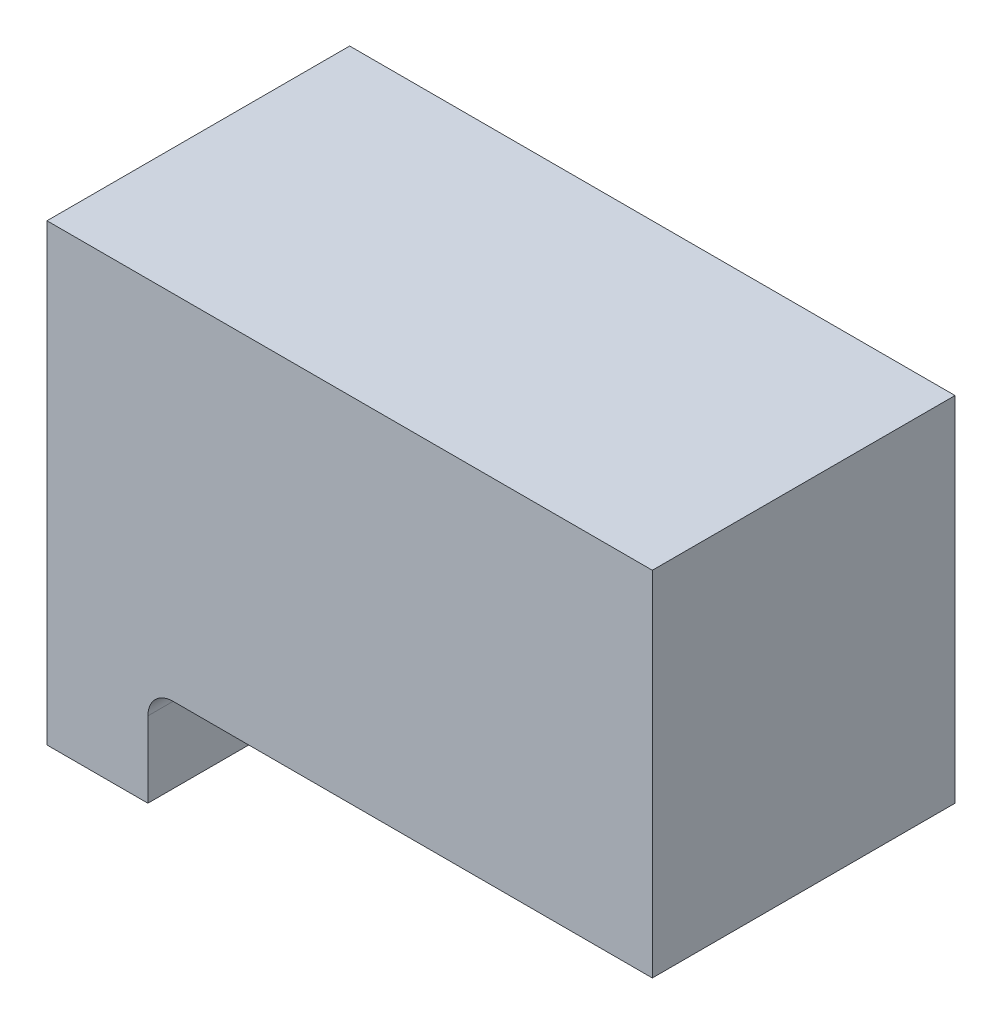
ISO-10303-21;
HEADER;
FILE_DESCRIPTION(('STEP AP214'),'2;1');
FILE_NAME('part.step','',(''),(''),'','','');
FILE_SCHEMA(('AUTOMOTIVE_DESIGN { 1 0 10303 214 1 1 1 1 }'));
ENDSEC;
DATA;
#1=APPLICATION_CONTEXT('core data for automotive mechanical design processes');
#2=APPLICATION_PROTOCOL_DEFINITION('international standard','automotive_design',2000,#1);
#3=PRODUCT_CONTEXT('',#1,'mechanical');
#4=PRODUCT('Part','Part','',(#3));
#5=PRODUCT_RELATED_PRODUCT_CATEGORY('part','',(#4));
#6=PRODUCT_DEFINITION_FORMATION('','',#4);
#7=PRODUCT_DEFINITION_CONTEXT('part definition',#1,'design');
#8=PRODUCT_DEFINITION('design','',#6,#7);
#9=PRODUCT_DEFINITION_SHAPE('','',#8);
#10=(LENGTH_UNIT() NAMED_UNIT(*) SI_UNIT(.MILLI.,.METRE.));
#11=(NAMED_UNIT(*) PLANE_ANGLE_UNIT() SI_UNIT($,.RADIAN.));
#12=(NAMED_UNIT(*) SI_UNIT($,.STERADIAN.) SOLID_ANGLE_UNIT());
#13=UNCERTAINTY_MEASURE_WITH_UNIT(LENGTH_MEASURE(1.E-05),#10,'distance_accuracy_value','');
#14=(GEOMETRIC_REPRESENTATION_CONTEXT(3) GLOBAL_UNCERTAINTY_ASSIGNED_CONTEXT((#13)) GLOBAL_UNIT_ASSIGNED_CONTEXT((#10,
#11,#12)) REPRESENTATION_CONTEXT('',''));
#15=CARTESIAN_POINT('',(0.,0.,0.));
#16=DIRECTION('',(0.,0.,1.));
#17=DIRECTION('',(1.,0.,0.));
#18=AXIS2_PLACEMENT_3D('',#15,#16,#17);
#19=CARTESIAN_POINT('',(0.,0.,25.));
#20=DIRECTION('',(0.,0.,-1.));
#21=DIRECTION('',(-1.,0.,0.));
#22=AXIS2_PLACEMENT_3D('',#19,#20,#21);
#23=PLANE('',#22);
#24=DIRECTION('',(0.,1.,0.));
#25=VECTOR('',#24,1.);
#26=CARTESIAN_POINT('',(5.,0.,25.));
#27=LINE('',#26,#25);
#28=CARTESIAN_POINT('',(4.99999999999999,27.5,25.));
#29=VERTEX_POINT('',#28);
#30=CARTESIAN_POINT('',(5.,7.5,25.));
#31=VERTEX_POINT('',#30);
#32=EDGE_CURVE('E164',#29,#31,#27,.F.);
#33=ORIENTED_EDGE('',*,*,#32,.F.);
#34=CARTESIAN_POINT('',(7.49999999999999,27.5,25.));
#35=DIRECTION('',(0.,0.,1.));
#36=DIRECTION('',(1.,0.,0.));
#37=AXIS2_PLACEMENT_3D('',#34,#35,#36);
#38=CIRCLE('',#37,2.5);
#39=CARTESIAN_POINT('',(7.49999999999999,30.,25.));
#40=VERTEX_POINT('',#39);
#41=EDGE_CURVE('E160',#29,#40,#38,.F.);
#42=ORIENTED_EDGE('',*,*,#41,.T.);
#43=DIRECTION('',(1.,0.,0.));
#44=VECTOR('',#43,1.);
#45=CARTESIAN_POINT('',(0.,30.,25.));
#46=LINE('',#45,#44);
#47=CARTESIAN_POINT('',(27.5,30.,25.));
#48=VERTEX_POINT('',#47);
#49=EDGE_CURVE('E156',#48,#40,#46,.F.);
#50=ORIENTED_EDGE('',*,*,#49,.F.);
#51=CARTESIAN_POINT('',(27.5,27.5,25.));
#52=DIRECTION('',(0.,0.,-1.));
#53=DIRECTION('',(-1.,0.,0.));
#54=AXIS2_PLACEMENT_3D('',#51,#52,#53);
#55=CIRCLE('',#54,2.5);
#56=CARTESIAN_POINT('',(30.,27.5,25.));
#57=VERTEX_POINT('',#56);
#58=EDGE_CURVE('E134',#48,#57,#55,.T.);
#59=ORIENTED_EDGE('',*,*,#58,.T.);
#60=DIRECTION('',(0.,1.,0.));
#61=VECTOR('',#60,1.);
#62=CARTESIAN_POINT('',(30.,0.,25.));
#63=LINE('',#62,#61);
#64=CARTESIAN_POINT('',(30.,7.5,25.));
#65=VERTEX_POINT('',#64);
#66=EDGE_CURVE('E132',#57,#65,#63,.F.);
#67=ORIENTED_EDGE('',*,*,#66,.T.);
#68=CARTESIAN_POINT('',(27.5,7.5,25.));
#69=DIRECTION('',(0.,0.,1.));
#70=DIRECTION('',(1.,0.,0.));
#71=AXIS2_PLACEMENT_3D('',#68,#69,#70);
#72=CIRCLE('',#71,2.5);
#73=CARTESIAN_POINT('',(27.5,5.,25.));
#74=VERTEX_POINT('',#73);
#75=EDGE_CURVE('E20',#65,#74,#72,.F.);
#76=ORIENTED_EDGE('',*,*,#75,.T.);
#77=DIRECTION('',(1.,0.,0.));
#78=VECTOR('',#77,1.);
#79=CARTESIAN_POINT('',(0.,5.,25.));
#80=LINE('',#79,#78);
#81=CARTESIAN_POINT('',(7.5,5.,25.));
#82=VERTEX_POINT('',#81);
#83=EDGE_CURVE('E169',#74,#82,#80,.F.);
#84=ORIENTED_EDGE('',*,*,#83,.T.);
#85=CARTESIAN_POINT('',(7.5,7.5,25.));
#86=DIRECTION('',(0.,0.,-1.));
#87=DIRECTION('',(-1.,0.,0.));
#88=AXIS2_PLACEMENT_3D('',#85,#86,#87);
#89=CIRCLE('',#88,2.5);
#90=EDGE_CURVE('E168',#82,#31,#89,.T.);
#91=ORIENTED_EDGE('',*,*,#90,.T.);
#92=EDGE_LOOP('',(#33,#42,#50,#59,#67,#76,#84,#91));
#93=FACE_BOUND('',#92,.T.);
#94=ADVANCED_FACE('F17',(#93),#23,.T.);
#95=CARTESIAN_POINT('',(27.5,7.5,25.));
#96=DIRECTION('',(0.,0.,1.));
#97=DIRECTION('',(1.,0.,0.));
#98=AXIS2_PLACEMENT_3D('',#95,#96,#97);
#99=CYLINDRICAL_SURFACE('',#98,2.5);
#100=DIRECTION('',(0.,0.,1.));
#101=VECTOR('',#100,1.);
#102=CARTESIAN_POINT('',(30.,7.5,25.));
#103=LINE('',#102,#101);
#104=CARTESIAN_POINT('',(30.,7.5,0.));
#105=VERTEX_POINT('',#104);
#106=EDGE_CURVE('E125',#65,#105,#103,.F.);
#107=ORIENTED_EDGE('',*,*,#106,.T.);
#108=CARTESIAN_POINT('',(27.5,7.5,0.));
#109=DIRECTION('',(0.,0.,1.));
#110=DIRECTION('',(1.,0.,0.));
#111=AXIS2_PLACEMENT_3D('',#108,#109,#110);
#112=CIRCLE('',#111,2.5);
#113=CARTESIAN_POINT('',(27.5,5.,0.));
#114=VERTEX_POINT('',#113);
#115=EDGE_CURVE('E138',#105,#114,#112,.F.);
#116=ORIENTED_EDGE('',*,*,#115,.T.);
#117=DIRECTION('',(0.,0.,1.));
#118=VECTOR('',#117,1.);
#119=CARTESIAN_POINT('',(27.5,5.,25.));
#120=LINE('',#119,#118);
#121=EDGE_CURVE('E128',#114,#74,#120,.T.);
#122=ORIENTED_EDGE('',*,*,#121,.T.);
#123=ORIENTED_EDGE('',*,*,#75,.F.);
#124=EDGE_LOOP('',(#107,#116,#122,#123));
#125=FACE_BOUND('',#124,.T.);
#126=ADVANCED_FACE('F123',(#125),#99,.F.);
#127=CARTESIAN_POINT('',(0.,5.,25.));
#128=DIRECTION('',(0.,-1.,0.));
#129=DIRECTION('',(1.,0.,0.));
#130=AXIS2_PLACEMENT_3D('',#127,#128,#129);
#131=PLANE('',#130);
#132=ORIENTED_EDGE('',*,*,#121,.F.);
#133=DIRECTION('',(1.,0.,0.));
#134=VECTOR('',#133,1.);
#135=CARTESIAN_POINT('',(0.,5.,0.));
#136=LINE('',#135,#134);
#137=CARTESIAN_POINT('',(7.5,5.,0.));
#138=VERTEX_POINT('',#137);
#139=EDGE_CURVE('E193',#114,#138,#136,.F.);
#140=ORIENTED_EDGE('',*,*,#139,.T.);
#141=DIRECTION('',(0.,0.,-1.));
#142=VECTOR('',#141,1.);
#143=CARTESIAN_POINT('',(7.5,5.,25.));
#144=LINE('',#143,#142);
#145=EDGE_CURVE('E165',#138,#82,#144,.F.);
#146=ORIENTED_EDGE('',*,*,#145,.T.);
#147=ORIENTED_EDGE('',*,*,#83,.F.);
#148=EDGE_LOOP('',(#132,#140,#146,#147));
#149=FACE_BOUND('',#148,.T.);
#150=ADVANCED_FACE('F445',(#149),#131,.F.);
#151=CARTESIAN_POINT('',(7.5,7.5,25.));
#152=DIRECTION('',(0.,0.,-1.));
#153=DIRECTION('',(-1.,0.,0.));
#154=AXIS2_PLACEMENT_3D('',#151,#152,#153);
#155=CYLINDRICAL_SURFACE('',#154,2.5);
#156=ORIENTED_EDGE('',*,*,#145,.F.);
#157=CARTESIAN_POINT('',(7.5,7.5,0.));
#158=DIRECTION('',(0.,0.,-1.));
#159=DIRECTION('',(-1.,0.,0.));
#160=AXIS2_PLACEMENT_3D('',#157,#158,#159);
#161=CIRCLE('',#160,2.5);
#162=CARTESIAN_POINT('',(5.,7.5,0.));
#163=VERTEX_POINT('',#162);
#164=EDGE_CURVE('E191',#138,#163,#161,.T.);
#165=ORIENTED_EDGE('',*,*,#164,.T.);
#166=DIRECTION('',(0.,0.,1.));
#167=VECTOR('',#166,1.);
#168=CARTESIAN_POINT('',(5.,7.5,25.));
#169=LINE('',#168,#167);
#170=EDGE_CURVE('E161',#31,#163,#169,.F.);
#171=ORIENTED_EDGE('',*,*,#170,.F.);
#172=ORIENTED_EDGE('',*,*,#90,.F.);
#173=EDGE_LOOP('',(#156,#165,#171,#172));
#174=FACE_BOUND('',#173,.T.);
#175=ADVANCED_FACE('F199',(#174),#155,.F.);
#176=CARTESIAN_POINT('',(5.,0.,25.));
#177=DIRECTION('',(1.,0.,0.));
#178=DIRECTION('',(0.,1.,0.));
#179=AXIS2_PLACEMENT_3D('',#176,#177,#178);
#180=PLANE('',#179);
#181=ORIENTED_EDGE('',*,*,#32,.T.);
#182=ORIENTED_EDGE('',*,*,#170,.T.);
#183=DIRECTION('',(0.,1.,0.));
#184=VECTOR('',#183,1.);
#185=CARTESIAN_POINT('',(5.,0.,0.));
#186=LINE('',#185,#184);
#187=CARTESIAN_POINT('',(4.99999999999999,27.5,0.));
#188=VERTEX_POINT('',#187);
#189=EDGE_CURVE('E190',#163,#188,#186,.T.);
#190=ORIENTED_EDGE('',*,*,#189,.T.);
#191=DIRECTION('',(0.,0.,1.));
#192=VECTOR('',#191,1.);
#193=CARTESIAN_POINT('',(4.99999999999999,27.5,25.));
#194=LINE('',#193,#192);
#195=EDGE_CURVE('E157',#188,#29,#194,.T.);
#196=ORIENTED_EDGE('',*,*,#195,.T.);
#197=EDGE_LOOP('',(#181,#182,#190,#196));
#198=FACE_BOUND('',#197,.T.);
#199=ADVANCED_FACE('F203',(#198),#180,.T.);
#200=CARTESIAN_POINT('',(7.49999999999999,27.5,25.));
#201=DIRECTION('',(0.,0.,1.));
#202=DIRECTION('',(1.,0.,0.));
#203=AXIS2_PLACEMENT_3D('',#200,#201,#202);
#204=CYLINDRICAL_SURFACE('',#203,2.5);
#205=ORIENTED_EDGE('',*,*,#195,.F.);
#206=CARTESIAN_POINT('',(7.49999999999999,27.5,0.));
#207=DIRECTION('',(0.,0.,1.));
#208=DIRECTION('',(1.,0.,0.));
#209=AXIS2_PLACEMENT_3D('',#206,#207,#208);
#210=CIRCLE('',#209,2.5);
#211=CARTESIAN_POINT('',(7.49999999999999,30.,0.));
#212=VERTEX_POINT('',#211);
#213=EDGE_CURVE('E188',#188,#212,#210,.F.);
#214=ORIENTED_EDGE('',*,*,#213,.T.);
#215=DIRECTION('',(0.,0.,-1.));
#216=VECTOR('',#215,1.);
#217=CARTESIAN_POINT('',(7.49999999999999,30.,25.));
#218=LINE('',#217,#216);
#219=EDGE_CURVE('E153',#40,#212,#218,.T.);
#220=ORIENTED_EDGE('',*,*,#219,.F.);
#221=ORIENTED_EDGE('',*,*,#41,.F.);
#222=EDGE_LOOP('',(#205,#214,#220,#221));
#223=FACE_BOUND('',#222,.T.);
#224=ADVANCED_FACE('F209',(#223),#204,.F.);
#225=CARTESIAN_POINT('',(0.,30.,25.));
#226=DIRECTION('',(0.,-1.,0.));
#227=DIRECTION('',(0.,0.,-1.));
#228=AXIS2_PLACEMENT_3D('',#225,#226,#227);
#229=PLANE('',#228);
#230=ORIENTED_EDGE('',*,*,#49,.T.);
#231=ORIENTED_EDGE('',*,*,#219,.T.);
#232=DIRECTION('',(1.,0.,0.));
#233=VECTOR('',#232,1.);
#234=CARTESIAN_POINT('',(0.,30.,0.));
#235=LINE('',#234,#233);
#236=CARTESIAN_POINT('',(27.5,30.,0.));
#237=VERTEX_POINT('',#236);
#238=EDGE_CURVE('E187',#212,#237,#235,.T.);
#239=ORIENTED_EDGE('',*,*,#238,.T.);
#240=DIRECTION('',(0.,0.,-1.));
#241=VECTOR('',#240,1.);
#242=CARTESIAN_POINT('',(27.5,30.,25.));
#243=LINE('',#242,#241);
#244=EDGE_CURVE('E147',#237,#48,#243,.F.);
#245=ORIENTED_EDGE('',*,*,#244,.T.);
#246=EDGE_LOOP('',(#230,#231,#239,#245));
#247=FACE_BOUND('',#246,.T.);
#248=ADVANCED_FACE('F212',(#247),#229,.T.);
#249=CARTESIAN_POINT('',(27.5,27.5,25.));
#250=DIRECTION('',(0.,0.,-1.));
#251=DIRECTION('',(-1.,0.,0.));
#252=AXIS2_PLACEMENT_3D('',#249,#250,#251);
#253=CYLINDRICAL_SURFACE('',#252,2.5);
#254=ORIENTED_EDGE('',*,*,#244,.F.);
#255=CARTESIAN_POINT('',(27.5,27.5,0.));
#256=DIRECTION('',(0.,0.,-1.));
#257=DIRECTION('',(-1.,0.,0.));
#258=AXIS2_PLACEMENT_3D('',#255,#256,#257);
#259=CIRCLE('',#258,2.5);
#260=CARTESIAN_POINT('',(30.,27.5,0.));
#261=VERTEX_POINT('',#260);
#262=EDGE_CURVE('E185',#237,#261,#259,.T.);
#263=ORIENTED_EDGE('',*,*,#262,.T.);
#264=DIRECTION('',(0.,0.,1.));
#265=VECTOR('',#264,1.);
#266=CARTESIAN_POINT('',(30.,27.5,25.));
#267=LINE('',#266,#265);
#268=EDGE_CURVE('E139',#261,#57,#267,.T.);
#269=ORIENTED_EDGE('',*,*,#268,.T.);
#270=ORIENTED_EDGE('',*,*,#58,.F.);
#271=EDGE_LOOP('',(#254,#263,#269,#270));
#272=FACE_BOUND('',#271,.T.);
#273=ADVANCED_FACE('F216',(#272),#253,.F.);
#274=CARTESIAN_POINT('',(30.,0.,25.));
#275=DIRECTION('',(1.,0.,0.));
#276=DIRECTION('',(0.,1.,0.));
#277=AXIS2_PLACEMENT_3D('',#274,#275,#276);
#278=PLANE('',#277);
#279=ORIENTED_EDGE('',*,*,#268,.F.);
#280=DIRECTION('',(0.,1.,0.));
#281=VECTOR('',#280,1.);
#282=CARTESIAN_POINT('',(30.,0.,0.));
#283=LINE('',#282,#281);
#284=EDGE_CURVE('E143',#261,#105,#283,.F.);
#285=ORIENTED_EDGE('',*,*,#284,.T.);
#286=ORIENTED_EDGE('',*,*,#106,.F.);
#287=ORIENTED_EDGE('',*,*,#66,.F.);
#288=EDGE_LOOP('',(#279,#285,#286,#287));
#289=FACE_BOUND('',#288,.T.);
#290=ADVANCED_FACE('F141',(#289),#278,.F.);
#291=CARTESIAN_POINT('',(0.,0.,0.));
#292=DIRECTION('',(0.,0.,1.));
#293=DIRECTION('',(1.,0.,0.));
#294=AXIS2_PLACEMENT_3D('',#291,#292,#293);
#295=PLANE('',#294);
#296=ORIENTED_EDGE('',*,*,#262,.F.);
#297=ORIENTED_EDGE('',*,*,#238,.F.);
#298=ORIENTED_EDGE('',*,*,#213,.F.);
#299=ORIENTED_EDGE('',*,*,#189,.F.);
#300=ORIENTED_EDGE('',*,*,#164,.F.);
#301=ORIENTED_EDGE('',*,*,#139,.F.);
#302=ORIENTED_EDGE('',*,*,#115,.F.);
#303=ORIENTED_EDGE('',*,*,#284,.F.);
#304=EDGE_LOOP('',(#296,#297,#298,#299,#300,#301,#302,#303));
#305=FACE_BOUND('',#304,.T.);
#306=CARTESIAN_POINT('',(12.5,-2.5,0.));
#307=DIRECTION('',(0.,0.,-1.));
#308=DIRECTION('',(-1.,0.,0.));
#309=AXIS2_PLACEMENT_3D('',#306,#307,#308);
#310=CIRCLE('',#309,2.5);
#311=CARTESIAN_POINT('',(12.5,0.,0.));
#312=VERTEX_POINT('',#311);
#313=CARTESIAN_POINT('',(10.,-2.5,0.));
#314=VERTEX_POINT('',#313);
#315=EDGE_CURVE('E181',#312,#314,#310,.F.);
#316=ORIENTED_EDGE('',*,*,#315,.T.);
#317=DIRECTION('',(0.,1.,0.));
#318=VECTOR('',#317,1.);
#319=CARTESIAN_POINT('',(10.,-10.,0.));
#320=LINE('',#319,#318);
#321=CARTESIAN_POINT('',(10.,-10.,0.));
#322=VERTEX_POINT('',#321);
#323=EDGE_CURVE('E249',#322,#314,#320,.T.);
#324=ORIENTED_EDGE('',*,*,#323,.F.);
#325=DIRECTION('',(1.,0.,0.));
#326=VECTOR('',#325,1.);
#327=CARTESIAN_POINT('',(0.,-10.,0.));
#328=LINE('',#327,#326);
#329=CARTESIAN_POINT('',(0.,-10.,0.));
#330=VERTEX_POINT('',#329);
#331=EDGE_CURVE('E252',#330,#322,#328,.T.);
#332=ORIENTED_EDGE('',*,*,#331,.F.);
#333=DIRECTION('',(0.,-1.,0.));
#334=VECTOR('',#333,1.);
#335=CARTESIAN_POINT('',(0.,0.,0.));
#336=LINE('',#335,#334);
#337=CARTESIAN_POINT('',(0.,35.,0.));
#338=VERTEX_POINT('',#337);
#339=EDGE_CURVE('E221',#338,#330,#336,.T.);
#340=ORIENTED_EDGE('',*,*,#339,.F.);
#341=DIRECTION('',(1.,0.,0.));
#342=VECTOR('',#341,1.);
#343=CARTESIAN_POINT('',(0.,35.,0.));
#344=LINE('',#343,#342);
#345=CARTESIAN_POINT('',(60.,35.,0.));
#346=VERTEX_POINT('',#345);
#347=EDGE_CURVE('E235',#346,#338,#344,.F.);
#348=ORIENTED_EDGE('',*,*,#347,.F.);
#349=DIRECTION('',(0.,-1.,0.));
#350=VECTOR('',#349,1.);
#351=CARTESIAN_POINT('',(60.,0.,0.));
#352=LINE('',#351,#350);
#353=CARTESIAN_POINT('',(60.,0.,0.));
#354=VERTEX_POINT('',#353);
#355=EDGE_CURVE('E232',#346,#354,#352,.T.);
#356=ORIENTED_EDGE('',*,*,#355,.T.);
#357=DIRECTION('',(1.,0.,0.));
#358=VECTOR('',#357,1.);
#359=CARTESIAN_POINT('',(0.,0.,0.));
#360=LINE('',#359,#358);
#361=EDGE_CURVE('E244',#354,#312,#360,.F.);
#362=ORIENTED_EDGE('',*,*,#361,.T.);
#363=EDGE_LOOP('',(#316,#324,#332,#340,#348,#356,#362));
#364=FACE_BOUND('',#363,.T.);
#365=ADVANCED_FACE('F218',(#305,#364),#295,.F.);
#366=CARTESIAN_POINT('',(0.,0.,30.));
#367=DIRECTION('',(-1.,0.,0.));
#368=DIRECTION('',(0.,-1.,0.));
#369=AXIS2_PLACEMENT_3D('',#366,#367,#368);
#370=PLANE('',#369);
#371=DIRECTION('',(0.,1.,0.));
#372=VECTOR('',#371,1.);
#373=CARTESIAN_POINT('',(0.,0.,30.));
#374=LINE('',#373,#372);
#375=CARTESIAN_POINT('',(0.,35.,30.));
#376=VERTEX_POINT('',#375);
#377=CARTESIAN_POINT('',(0.,-10.,30.));
#378=VERTEX_POINT('',#377);
#379=EDGE_CURVE('E240',#376,#378,#374,.F.);
#380=ORIENTED_EDGE('',*,*,#379,.F.);
#381=DIRECTION('',(0.,0.,1.));
#382=VECTOR('',#381,1.);
#383=CARTESIAN_POINT('',(0.,35.,30.));
#384=LINE('',#383,#382);
#385=EDGE_CURVE('E241',#338,#376,#384,.T.);
#386=ORIENTED_EDGE('',*,*,#385,.F.);
#387=ORIENTED_EDGE('',*,*,#339,.T.);
#388=DIRECTION('',(0.,0.,-1.));
#389=VECTOR('',#388,1.);
#390=CARTESIAN_POINT('',(0.,-10.,0.));
#391=LINE('',#390,#389);
#392=EDGE_CURVE('E223',#378,#330,#391,.T.);
#393=ORIENTED_EDGE('',*,*,#392,.F.);
#394=EDGE_LOOP('',(#380,#386,#387,#393));
#395=FACE_BOUND('',#394,.T.);
#396=ADVANCED_FACE('F324',(#395),#370,.T.);
#397=CARTESIAN_POINT('',(0.,-10.,0.));
#398=DIRECTION('',(0.,-1.,0.));
#399=DIRECTION('',(0.,0.,-1.));
#400=AXIS2_PLACEMENT_3D('',#397,#398,#399);
#401=PLANE('',#400);
#402=ORIENTED_EDGE('',*,*,#392,.T.);
#403=ORIENTED_EDGE('',*,*,#331,.T.);
#404=DIRECTION('',(0.,0.,-1.));
#405=VECTOR('',#404,1.);
#406=CARTESIAN_POINT('',(10.,-10.,0.));
#407=LINE('',#406,#405);
#408=CARTESIAN_POINT('',(10.,-10.,30.));
#409=VERTEX_POINT('',#408);
#410=EDGE_CURVE('E184',#409,#322,#407,.T.);
#411=ORIENTED_EDGE('',*,*,#410,.F.);
#412=DIRECTION('',(1.,0.,0.));
#413=VECTOR('',#412,1.);
#414=CARTESIAN_POINT('',(0.,-10.,30.));
#415=LINE('',#414,#413);
#416=EDGE_CURVE('E271',#378,#409,#415,.T.);
#417=ORIENTED_EDGE('',*,*,#416,.F.);
#418=EDGE_LOOP('',(#402,#403,#411,#417));
#419=FACE_BOUND('',#418,.T.);
#420=ADVANCED_FACE('F322',(#419),#401,.T.);
#421=CARTESIAN_POINT('',(10.,-10.,0.));
#422=DIRECTION('',(1.,0.,0.));
#423=DIRECTION('',(0.,0.,-1.));
#424=AXIS2_PLACEMENT_3D('',#421,#422,#423);
#425=PLANE('',#424);
#426=DIRECTION('',(0.,1.,0.));
#427=VECTOR('',#426,1.);
#428=CARTESIAN_POINT('',(10.,0.,30.));
#429=LINE('',#428,#427);
#430=CARTESIAN_POINT('',(10.,-2.5,30.));
#431=VERTEX_POINT('',#430);
#432=EDGE_CURVE('E180',#409,#431,#429,.T.);
#433=ORIENTED_EDGE('',*,*,#432,.F.);
#434=ORIENTED_EDGE('',*,*,#410,.T.);
#435=ORIENTED_EDGE('',*,*,#323,.T.);
#436=DIRECTION('',(0.,0.,-1.));
#437=VECTOR('',#436,1.);
#438=CARTESIAN_POINT('',(10.,-2.5,30.));
#439=LINE('',#438,#437);
#440=EDGE_CURVE('E183',#314,#431,#439,.F.);
#441=ORIENTED_EDGE('',*,*,#440,.T.);
#442=EDGE_LOOP('',(#433,#434,#435,#441));
#443=FACE_BOUND('',#442,.T.);
#444=ADVANCED_FACE('F321',(#443),#425,.T.);
#445=CARTESIAN_POINT('',(12.5,-2.5,30.));
#446=DIRECTION('',(0.,0.,-1.));
#447=DIRECTION('',(-1.,0.,0.));
#448=AXIS2_PLACEMENT_3D('',#445,#446,#447);
#449=CYLINDRICAL_SURFACE('',#448,2.5);
#450=ORIENTED_EDGE('',*,*,#440,.F.);
#451=ORIENTED_EDGE('',*,*,#315,.F.);
#452=DIRECTION('',(0.,0.,1.));
#453=VECTOR('',#452,1.);
#454=CARTESIAN_POINT('',(12.5,0.,30.));
#455=LINE('',#454,#453);
#456=CARTESIAN_POINT('',(12.5,0.,30.));
#457=VERTEX_POINT('',#456);
#458=EDGE_CURVE('E246',#312,#457,#455,.T.);
#459=ORIENTED_EDGE('',*,*,#458,.T.);
#460=CARTESIAN_POINT('',(12.5,-2.5,30.));
#461=DIRECTION('',(0.,0.,-1.));
#462=DIRECTION('',(-1.,0.,0.));
#463=AXIS2_PLACEMENT_3D('',#460,#461,#462);
#464=CIRCLE('',#463,2.5);
#465=EDGE_CURVE('E176',#431,#457,#464,.T.);
#466=ORIENTED_EDGE('',*,*,#465,.F.);
#467=EDGE_LOOP('',(#450,#451,#459,#466));
#468=FACE_BOUND('',#467,.T.);
#469=ADVANCED_FACE('F319',(#468),#449,.F.);
#470=CARTESIAN_POINT('',(0.,0.,30.));
#471=DIRECTION('',(0.,1.,0.));
#472=DIRECTION('',(0.,0.,1.));
#473=AXIS2_PLACEMENT_3D('',#470,#471,#472);
#474=PLANE('',#473);
#475=ORIENTED_EDGE('',*,*,#458,.F.);
#476=ORIENTED_EDGE('',*,*,#361,.F.);
#477=DIRECTION('',(0.,0.,1.));
#478=VECTOR('',#477,1.);
#479=CARTESIAN_POINT('',(60.,0.,30.));
#480=LINE('',#479,#478);
#481=CARTESIAN_POINT('',(60.,0.,30.));
#482=VERTEX_POINT('',#481);
#483=EDGE_CURVE('E236',#354,#482,#480,.T.);
#484=ORIENTED_EDGE('',*,*,#483,.T.);
#485=DIRECTION('',(1.,0.,0.));
#486=VECTOR('',#485,1.);
#487=CARTESIAN_POINT('',(0.,0.,30.));
#488=LINE('',#487,#486);
#489=EDGE_CURVE('E179',#457,#482,#488,.T.);
#490=ORIENTED_EDGE('',*,*,#489,.F.);
#491=EDGE_LOOP('',(#475,#476,#484,#490));
#492=FACE_BOUND('',#491,.T.);
#493=ADVANCED_FACE('F315',(#492),#474,.F.);
#494=CARTESIAN_POINT('',(60.,0.,30.));
#495=DIRECTION('',(-1.,0.,0.));
#496=DIRECTION('',(0.,-1.,0.));
#497=AXIS2_PLACEMENT_3D('',#494,#495,#496);
#498=PLANE('',#497);
#499=DIRECTION('',(0.,0.,1.));
#500=VECTOR('',#499,1.);
#501=CARTESIAN_POINT('',(60.,35.,30.));
#502=LINE('',#501,#500);
#503=CARTESIAN_POINT('',(60.,35.,30.));
#504=VERTEX_POINT('',#503);
#505=EDGE_CURVE('E35',#504,#346,#502,.F.);
#506=ORIENTED_EDGE('',*,*,#505,.F.);
#507=DIRECTION('',(0.,1.,0.));
#508=VECTOR('',#507,1.);
#509=CARTESIAN_POINT('',(60.,0.,30.));
#510=LINE('',#509,#508);
#511=EDGE_CURVE('E26',#482,#504,#510,.T.);
#512=ORIENTED_EDGE('',*,*,#511,.F.);
#513=ORIENTED_EDGE('',*,*,#483,.F.);
#514=ORIENTED_EDGE('',*,*,#355,.F.);
#515=EDGE_LOOP('',(#506,#512,#513,#514));
#516=FACE_BOUND('',#515,.T.);
#517=ADVANCED_FACE('F286',(#516),#498,.F.);
#518=CARTESIAN_POINT('',(0.,35.,30.));
#519=DIRECTION('',(0.,1.,0.));
#520=DIRECTION('',(0.,0.,1.));
#521=AXIS2_PLACEMENT_3D('',#518,#519,#520);
#522=PLANE('',#521);
#523=DIRECTION('',(1.,0.,0.));
#524=VECTOR('',#523,1.);
#525=CARTESIAN_POINT('',(0.,35.,30.));
#526=LINE('',#525,#524);
#527=EDGE_CURVE('E11',#504,#376,#526,.F.);
#528=ORIENTED_EDGE('',*,*,#527,.F.);
#529=ORIENTED_EDGE('',*,*,#505,.T.);
#530=ORIENTED_EDGE('',*,*,#347,.T.);
#531=ORIENTED_EDGE('',*,*,#385,.T.);
#532=EDGE_LOOP('',(#528,#529,#530,#531));
#533=FACE_BOUND('',#532,.T.);
#534=ADVANCED_FACE('F283',(#533),#522,.T.);
#535=CARTESIAN_POINT('',(0.,0.,30.));
#536=DIRECTION('',(0.,0.,1.));
#537=DIRECTION('',(1.,0.,0.));
#538=AXIS2_PLACEMENT_3D('',#535,#536,#537);
#539=PLANE('',#538);
#540=ORIENTED_EDGE('',*,*,#511,.T.);
#541=ORIENTED_EDGE('',*,*,#527,.T.);
#542=ORIENTED_EDGE('',*,*,#379,.T.);
#543=ORIENTED_EDGE('',*,*,#416,.T.);
#544=ORIENTED_EDGE('',*,*,#432,.T.);
#545=ORIENTED_EDGE('',*,*,#465,.T.);
#546=ORIENTED_EDGE('',*,*,#489,.T.);
#547=EDGE_LOOP('',(#540,#541,#542,#543,#544,#545,#546));
#548=FACE_BOUND('',#547,.T.);
#549=ADVANCED_FACE('F312',(#548),#539,.T.);
#550=CLOSED_SHELL('',(#94,#126,#150,#175,#199,#224,#248,#273,#290,#365,#396,#420,#444,#469,#493,
#517,#534,#549));
#551=MANIFOLD_SOLID_BREP('B1',#550);
#552=ADVANCED_BREP_SHAPE_REPRESENTATION('',(#18,#551),#14);
#553=SHAPE_DEFINITION_REPRESENTATION(#9,#552);
ENDSEC;
END-ISO-10303-21;
